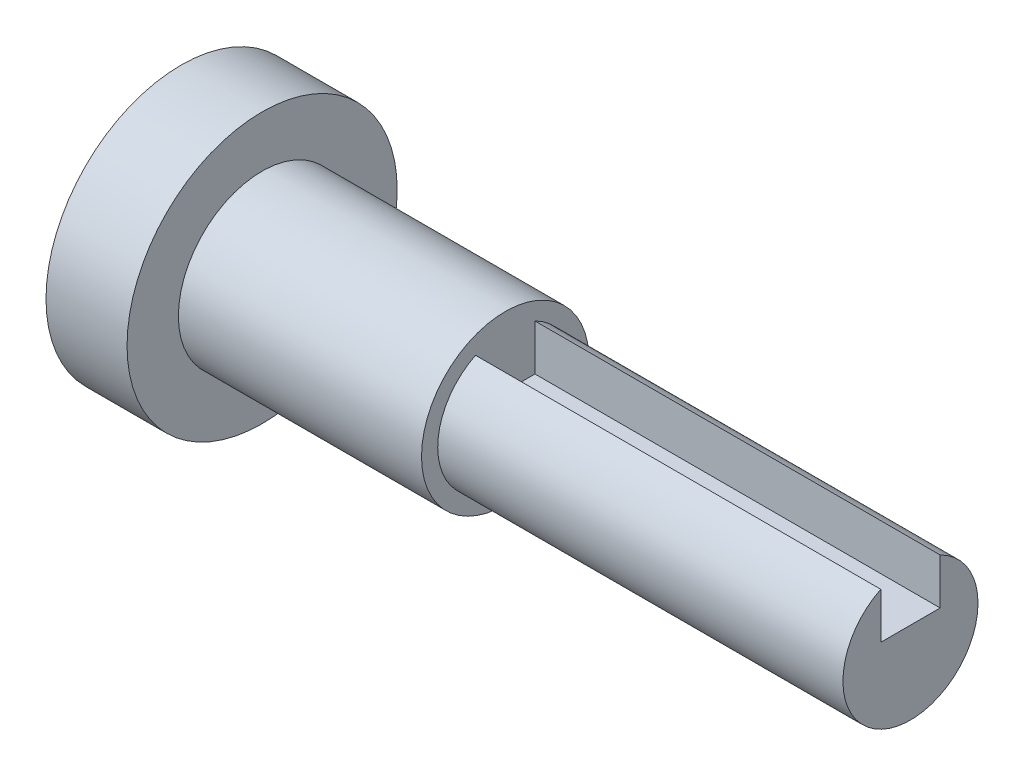
ISO-10303-21;
HEADER;
FILE_DESCRIPTION(('STEP AP214'),'2;1');
FILE_NAME('part.step','',(''),(''),'','','');
FILE_SCHEMA(('AUTOMOTIVE_DESIGN { 1 0 10303 214 1 1 1 1 }'));
ENDSEC;
DATA;
#1=APPLICATION_CONTEXT('core data for automotive mechanical design processes');
#2=APPLICATION_PROTOCOL_DEFINITION('international standard','automotive_design',2000,#1);
#3=PRODUCT_CONTEXT('',#1,'mechanical');
#4=PRODUCT('Part','Part','',(#3));
#5=PRODUCT_RELATED_PRODUCT_CATEGORY('part','',(#4));
#6=PRODUCT_DEFINITION_FORMATION('','',#4);
#7=PRODUCT_DEFINITION_CONTEXT('part definition',#1,'design');
#8=PRODUCT_DEFINITION('design','',#6,#7);
#9=PRODUCT_DEFINITION_SHAPE('','',#8);
#10=(LENGTH_UNIT() NAMED_UNIT(*) SI_UNIT(.MILLI.,.METRE.));
#11=(NAMED_UNIT(*) PLANE_ANGLE_UNIT() SI_UNIT($,.RADIAN.));
#12=(NAMED_UNIT(*) SI_UNIT($,.STERADIAN.) SOLID_ANGLE_UNIT());
#13=UNCERTAINTY_MEASURE_WITH_UNIT(LENGTH_MEASURE(1.E-05),#10,'distance_accuracy_value','');
#14=(GEOMETRIC_REPRESENTATION_CONTEXT(3) GLOBAL_UNCERTAINTY_ASSIGNED_CONTEXT((#13)) GLOBAL_UNIT_ASSIGNED_CONTEXT((#10,
#11,#12)) REPRESENTATION_CONTEXT('',''));
#15=CARTESIAN_POINT('',(0.,0.,0.));
#16=DIRECTION('',(0.,0.,1.));
#17=DIRECTION('',(1.,0.,0.));
#18=AXIS2_PLACEMENT_3D('',#15,#16,#17);
#19=CARTESIAN_POINT('',(0.,5.,0.));
#20=DIRECTION('',(1.,0.,0.));
#21=DIRECTION('',(0.,0.,-1.));
#22=AXIS2_PLACEMENT_3D('',#19,#20,#21);
#23=PLANE('',#22);
#24=CARTESIAN_POINT('',(0.,0.,0.));
#25=DIRECTION('',(-1.,0.,0.));
#26=DIRECTION('',(0.,0.,1.));
#27=AXIS2_PLACEMENT_3D('',#24,#25,#26);
#28=CIRCLE('',#27,5.);
#29=CARTESIAN_POINT('',(0.,0.,5.));
#30=VERTEX_POINT('',#29);
#31=EDGE_CURVE('E103',#30,#30,#28,.T.);
#32=ORIENTED_EDGE('',*,*,#31,.T.);
#33=EDGE_LOOP('',(#32));
#34=FACE_BOUND('',#33,.T.);
#35=ADVANCED_FACE('F33',(#34),#23,.F.);
#36=CARTESIAN_POINT('',(27.,0.,0.));
#37=DIRECTION('',(-1.,0.,0.));
#38=DIRECTION('',(0.,0.,1.));
#39=AXIS2_PLACEMENT_3D('',#36,#37,#38);
#40=PLANE('',#39);
#41=DIRECTION('',(0.,0.,-1.));
#42=VECTOR('',#41,1.);
#43=CARTESIAN_POINT('',(27.,0.544994432064365,1.1));
#44=LINE('',#43,#42);
#45=CARTESIAN_POINT('',(27.,0.544994432064365,1.1));
#46=VERTEX_POINT('',#45);
#47=CARTESIAN_POINT('',(27.,0.544994432064365,-1.1));
#48=VERTEX_POINT('',#47);
#49=EDGE_CURVE('E85',#46,#48,#44,.T.);
#50=ORIENTED_EDGE('',*,*,#49,.F.);
#51=DIRECTION('',(0.,-1.,0.));
#52=VECTOR('',#51,1.);
#53=CARTESIAN_POINT('',(27.,2.24499443206436,1.1));
#54=LINE('',#53,#52);
#55=CARTESIAN_POINT('',(27.,2.24499443206436,1.1));
#56=VERTEX_POINT('',#55);
#57=EDGE_CURVE('E89',#56,#46,#54,.T.);
#58=ORIENTED_EDGE('',*,*,#57,.F.);
#59=CARTESIAN_POINT('',(27.,0.,0.));
#60=DIRECTION('',(-1.,0.,0.));
#61=DIRECTION('',(0.,0.,1.));
#62=AXIS2_PLACEMENT_3D('',#59,#60,#61);
#63=CIRCLE('',#62,2.5);
#64=CARTESIAN_POINT('',(27.,2.24499443206436,-1.1));
#65=VERTEX_POINT('',#64);
#66=EDGE_CURVE('E11',#65,#56,#63,.T.);
#67=ORIENTED_EDGE('',*,*,#66,.F.);
#68=DIRECTION('',(0.,1.,0.));
#69=VECTOR('',#68,1.);
#70=CARTESIAN_POINT('',(27.,0.544994432064365,-1.1));
#71=LINE('',#70,#69);
#72=EDGE_CURVE('E81',#48,#65,#71,.T.);
#73=ORIENTED_EDGE('',*,*,#72,.F.);
#74=EDGE_LOOP('',(#50,#58,#67,#73));
#75=FACE_BOUND('',#74,.T.);
#76=ADVANCED_FACE('F92',(#75),#40,.F.);
#77=CARTESIAN_POINT('',(0.,0.,0.));
#78=DIRECTION('',(-1.,0.,0.));
#79=DIRECTION('',(0.,0.,1.));
#80=AXIS2_PLACEMENT_3D('',#77,#78,#79);
#81=CYLINDRICAL_SURFACE('',#80,2.5);
#82=CARTESIAN_POINT('',(12.,0.,0.));
#83=DIRECTION('',(-1.,0.,0.));
#84=DIRECTION('',(0.,0.,1.));
#85=AXIS2_PLACEMENT_3D('',#82,#83,#84);
#86=CIRCLE('',#85,2.5);
#87=CARTESIAN_POINT('',(12.,2.24499443206436,-1.1));
#88=VERTEX_POINT('',#87);
#89=CARTESIAN_POINT('',(12.,2.24499443206436,1.10000000000001));
#90=VERTEX_POINT('',#89);
#91=EDGE_CURVE('E40',#88,#90,#86,.T.);
#92=ORIENTED_EDGE('',*,*,#91,.F.);
#93=DIRECTION('',(1.,0.,0.));
#94=VECTOR('',#93,1.);
#95=CARTESIAN_POINT('',(8.65870706654563,2.24499443206436,-1.1));
#96=LINE('',#95,#94);
#97=EDGE_CURVE('E98',#88,#65,#96,.T.);
#98=ORIENTED_EDGE('',*,*,#97,.T.);
#99=ORIENTED_EDGE('',*,*,#66,.T.);
#100=DIRECTION('',(1.,0.,0.));
#101=VECTOR('',#100,1.);
#102=CARTESIAN_POINT('',(8.65870706654563,2.24499443206436,1.1));
#103=LINE('',#102,#101);
#104=EDGE_CURVE('E52',#90,#56,#103,.T.);
#105=ORIENTED_EDGE('',*,*,#104,.F.);
#106=EDGE_LOOP('',(#92,#98,#99,#105));
#107=FACE_BOUND('',#106,.T.);
#108=ADVANCED_FACE('F120',(#107),#81,.T.);
#109=CARTESIAN_POINT('',(12.,2.5,0.));
#110=DIRECTION('',(-1.,0.,0.));
#111=DIRECTION('',(0.,0.,1.));
#112=AXIS2_PLACEMENT_3D('',#109,#110,#111);
#113=PLANE('',#112);
#114=ORIENTED_EDGE('',*,*,#91,.T.);
#115=DIRECTION('',(0.,-1.,0.));
#116=VECTOR('',#115,1.);
#117=CARTESIAN_POINT('',(12.,2.24499443206436,1.1));
#118=LINE('',#117,#116);
#119=CARTESIAN_POINT('',(12.,0.544994432064365,1.1));
#120=VERTEX_POINT('',#119);
#121=EDGE_CURVE('E47',#90,#120,#118,.T.);
#122=ORIENTED_EDGE('',*,*,#121,.T.);
#123=DIRECTION('',(0.,0.,-1.));
#124=VECTOR('',#123,1.);
#125=CARTESIAN_POINT('',(12.,0.544994432064365,1.1));
#126=LINE('',#125,#124);
#127=CARTESIAN_POINT('',(12.,0.544994432064365,-1.1));
#128=VERTEX_POINT('',#127);
#129=EDGE_CURVE('E76',#120,#128,#126,.T.);
#130=ORIENTED_EDGE('',*,*,#129,.T.);
#131=DIRECTION('',(0.,1.,0.));
#132=VECTOR('',#131,1.);
#133=CARTESIAN_POINT('',(12.,0.544994432064365,-1.1));
#134=LINE('',#133,#132);
#135=EDGE_CURVE('E69',#128,#88,#134,.T.);
#136=ORIENTED_EDGE('',*,*,#135,.T.);
#137=EDGE_LOOP('',(#114,#122,#130,#136));
#138=FACE_BOUND('',#137,.T.);
#139=CARTESIAN_POINT('',(12.,0.,0.));
#140=DIRECTION('',(-1.,0.,0.));
#141=DIRECTION('',(0.,0.,1.));
#142=AXIS2_PLACEMENT_3D('',#139,#140,#141);
#143=CIRCLE('',#142,3.1);
#144=CARTESIAN_POINT('',(12.,0.,3.1));
#145=VERTEX_POINT('',#144);
#146=EDGE_CURVE('E112',#145,#145,#143,.T.);
#147=ORIENTED_EDGE('',*,*,#146,.F.);
#148=EDGE_LOOP('',(#147));
#149=FACE_BOUND('',#148,.T.);
#150=ADVANCED_FACE('F117',(#138,#149),#113,.F.);
#151=CARTESIAN_POINT('',(0.,0.,0.));
#152=DIRECTION('',(-1.,0.,0.));
#153=DIRECTION('',(0.,0.,1.));
#154=AXIS2_PLACEMENT_3D('',#151,#152,#153);
#155=CYLINDRICAL_SURFACE('',#154,3.1);
#156=CARTESIAN_POINT('',(3.,0.,0.));
#157=DIRECTION('',(-1.,0.,0.));
#158=DIRECTION('',(0.,0.,1.));
#159=AXIS2_PLACEMENT_3D('',#156,#157,#158);
#160=CIRCLE('',#159,3.1);
#161=CARTESIAN_POINT('',(3.,0.,3.1));
#162=VERTEX_POINT('',#161);
#163=EDGE_CURVE('E109',#162,#162,#160,.T.);
#164=ORIENTED_EDGE('',*,*,#163,.F.);
#165=EDGE_LOOP('',(#164));
#166=FACE_BOUND('',#165,.T.);
#167=ORIENTED_EDGE('',*,*,#146,.T.);
#168=EDGE_LOOP('',(#167));
#169=FACE_BOUND('',#168,.T.);
#170=ADVANCED_FACE('F127',(#166,#169),#155,.T.);
#171=CARTESIAN_POINT('',(3.,3.1,0.));
#172=DIRECTION('',(-1.,0.,0.));
#173=DIRECTION('',(0.,0.,1.));
#174=AXIS2_PLACEMENT_3D('',#171,#172,#173);
#175=PLANE('',#174);
#176=CARTESIAN_POINT('',(3.,0.,0.));
#177=DIRECTION('',(-1.,0.,0.));
#178=DIRECTION('',(0.,0.,1.));
#179=AXIS2_PLACEMENT_3D('',#176,#177,#178);
#180=CIRCLE('',#179,5.);
#181=CARTESIAN_POINT('',(3.,0.,5.));
#182=VERTEX_POINT('',#181);
#183=EDGE_CURVE('E106',#182,#182,#180,.T.);
#184=ORIENTED_EDGE('',*,*,#183,.F.);
#185=EDGE_LOOP('',(#184));
#186=FACE_BOUND('',#185,.T.);
#187=ORIENTED_EDGE('',*,*,#163,.T.);
#188=EDGE_LOOP('',(#187));
#189=FACE_BOUND('',#188,.T.);
#190=ADVANCED_FACE('F139',(#186,#189),#175,.F.);
#191=CARTESIAN_POINT('',(0.,0.,0.));
#192=DIRECTION('',(-1.,0.,0.));
#193=DIRECTION('',(0.,0.,1.));
#194=AXIS2_PLACEMENT_3D('',#191,#192,#193);
#195=CYLINDRICAL_SURFACE('',#194,5.);
#196=ORIENTED_EDGE('',*,*,#31,.F.);
#197=EDGE_LOOP('',(#196));
#198=FACE_BOUND('',#197,.T.);
#199=ORIENTED_EDGE('',*,*,#183,.T.);
#200=EDGE_LOOP('',(#199));
#201=FACE_BOUND('',#200,.T.);
#202=ADVANCED_FACE('F135',(#198,#201),#195,.T.);
#203=CARTESIAN_POINT('',(8.65870706654563,2.24499443206436,1.1));
#204=DIRECTION('',(0.,0.,1.));
#205=DIRECTION('',(0.,-1.,0.));
#206=AXIS2_PLACEMENT_3D('',#203,#204,#205);
#207=PLANE('',#206);
#208=ORIENTED_EDGE('',*,*,#104,.T.);
#209=ORIENTED_EDGE('',*,*,#57,.T.);
#210=DIRECTION('',(1.,0.,0.));
#211=VECTOR('',#210,1.);
#212=CARTESIAN_POINT('',(8.65870706654563,0.544994432064365,1.1));
#213=LINE('',#212,#211);
#214=EDGE_CURVE('E87',#120,#46,#213,.T.);
#215=ORIENTED_EDGE('',*,*,#214,.F.);
#216=ORIENTED_EDGE('',*,*,#121,.F.);
#217=EDGE_LOOP('',(#208,#209,#215,#216));
#218=FACE_BOUND('',#217,.T.);
#219=ADVANCED_FACE('F138',(#218),#207,.F.);
#220=CARTESIAN_POINT('',(8.65870706654563,0.544994432064365,1.1));
#221=DIRECTION('',(0.,-1.,0.));
#222=DIRECTION('',(0.,0.,-1.));
#223=AXIS2_PLACEMENT_3D('',#220,#221,#222);
#224=PLANE('',#223);
#225=ORIENTED_EDGE('',*,*,#214,.T.);
#226=ORIENTED_EDGE('',*,*,#49,.T.);
#227=DIRECTION('',(1.,0.,0.));
#228=VECTOR('',#227,1.);
#229=CARTESIAN_POINT('',(8.65870706654563,0.544994432064365,-1.1));
#230=LINE('',#229,#228);
#231=EDGE_CURVE('E77',#128,#48,#230,.T.);
#232=ORIENTED_EDGE('',*,*,#231,.F.);
#233=ORIENTED_EDGE('',*,*,#129,.F.);
#234=EDGE_LOOP('',(#225,#226,#232,#233));
#235=FACE_BOUND('',#234,.T.);
#236=ADVANCED_FACE('F86',(#235),#224,.F.);
#237=CARTESIAN_POINT('',(8.65870706654563,0.544994432064365,-1.1));
#238=DIRECTION('',(0.,0.,-1.));
#239=DIRECTION('',(0.,1.,0.));
#240=AXIS2_PLACEMENT_3D('',#237,#238,#239);
#241=PLANE('',#240);
#242=ORIENTED_EDGE('',*,*,#231,.T.);
#243=ORIENTED_EDGE('',*,*,#72,.T.);
#244=ORIENTED_EDGE('',*,*,#97,.F.);
#245=ORIENTED_EDGE('',*,*,#135,.F.);
#246=EDGE_LOOP('',(#242,#243,#244,#245));
#247=FACE_BOUND('',#246,.T.);
#248=ADVANCED_FACE('F79',(#247),#241,.F.);
#249=CLOSED_SHELL('',(#35,#76,#108,#150,#170,#190,#202,#219,#236,#248));
#250=MANIFOLD_SOLID_BREP('B2',#249);
#251=ADVANCED_BREP_SHAPE_REPRESENTATION('',(#18,#250),#14);
#252=SHAPE_DEFINITION_REPRESENTATION(#9,#251);
ENDSEC;
END-ISO-10303-21;
